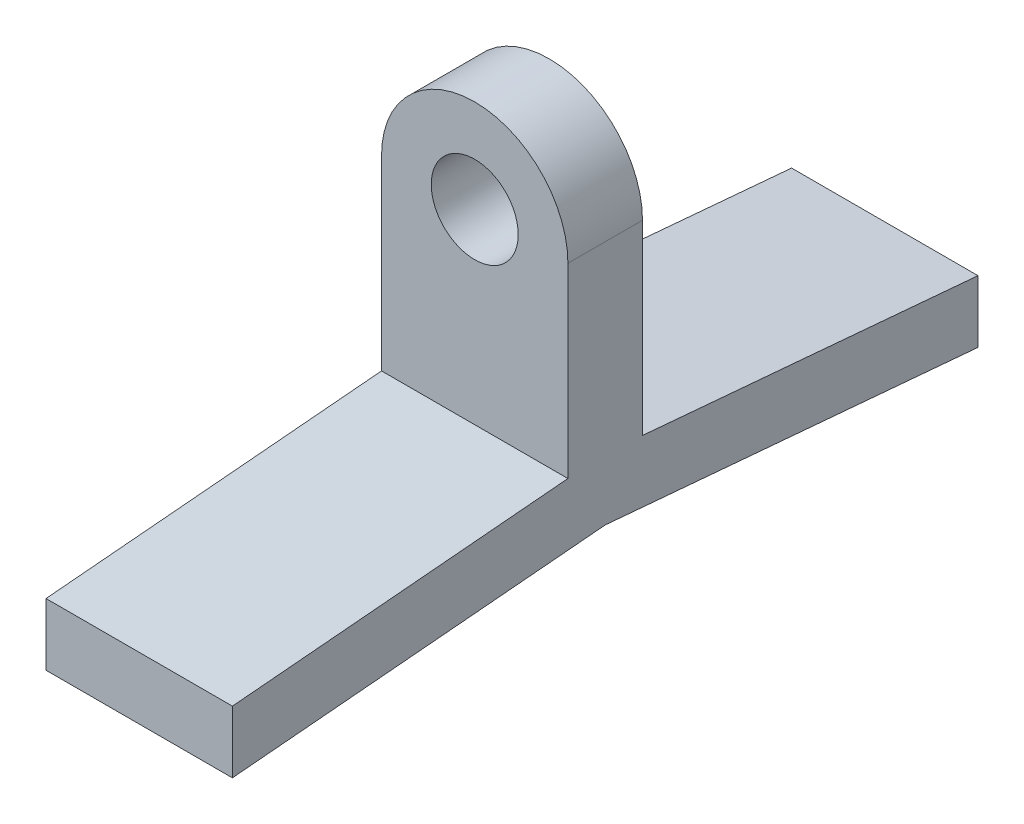
ISO-10303-21;
HEADER;
FILE_DESCRIPTION(('STEP AP214'),'2;1');
FILE_NAME('part.step','',(''),(''),'','','');
FILE_SCHEMA(('AUTOMOTIVE_DESIGN { 1 0 10303 214 1 1 1 1 }'));
ENDSEC;
DATA;
#1=APPLICATION_CONTEXT('core data for automotive mechanical design processes');
#2=APPLICATION_PROTOCOL_DEFINITION('international standard','automotive_design',2000,#1);
#3=PRODUCT_CONTEXT('',#1,'mechanical');
#4=PRODUCT('Part','Part','',(#3));
#5=PRODUCT_RELATED_PRODUCT_CATEGORY('part','',(#4));
#6=PRODUCT_DEFINITION_FORMATION('','',#4);
#7=PRODUCT_DEFINITION_CONTEXT('part definition',#1,'design');
#8=PRODUCT_DEFINITION('design','',#6,#7);
#9=PRODUCT_DEFINITION_SHAPE('','',#8);
#10=(LENGTH_UNIT() NAMED_UNIT(*) SI_UNIT(.MILLI.,.METRE.));
#11=(NAMED_UNIT(*) PLANE_ANGLE_UNIT() SI_UNIT($,.RADIAN.));
#12=(NAMED_UNIT(*) SI_UNIT($,.STERADIAN.) SOLID_ANGLE_UNIT());
#13=UNCERTAINTY_MEASURE_WITH_UNIT(LENGTH_MEASURE(1.E-05),#10,'distance_accuracy_value','');
#14=(GEOMETRIC_REPRESENTATION_CONTEXT(3) GLOBAL_UNCERTAINTY_ASSIGNED_CONTEXT((#13)) GLOBAL_UNIT_ASSIGNED_CONTEXT((#10,
#11,#12)) REPRESENTATION_CONTEXT('',''));
#15=CARTESIAN_POINT('',(0.,0.,0.));
#16=DIRECTION('',(0.,0.,1.));
#17=DIRECTION('',(1.,0.,0.));
#18=AXIS2_PLACEMENT_3D('',#15,#16,#17);
#19=CARTESIAN_POINT('',(0.,0.,6.));
#20=DIRECTION('',(0.,0.,-1.));
#21=DIRECTION('',(-1.,0.,0.));
#22=AXIS2_PLACEMENT_3D('',#19,#20,#21);
#23=PLANE('',#22);
#24=CARTESIAN_POINT('',(0.,0.,6.));
#25=DIRECTION('',(0.,0.,1.));
#26=DIRECTION('',(-1.,0.,0.));
#27=AXIS2_PLACEMENT_3D('',#24,#25,#26);
#28=CIRCLE('',#27,7.5);
#29=CARTESIAN_POINT('',(7.5,0.,6.));
#30=VERTEX_POINT('',#29);
#31=CARTESIAN_POINT('',(-7.5,0.,6.));
#32=VERTEX_POINT('',#31);
#33=EDGE_CURVE('E184',#30,#32,#28,.T.);
#34=ORIENTED_EDGE('',*,*,#33,.T.);
#35=DIRECTION('',(0.,-1.,0.));
#36=VECTOR('',#35,1.);
#37=CARTESIAN_POINT('',(-7.5,0.,6.));
#38=LINE('',#37,#36);
#39=CARTESIAN_POINT('',(-7.5,-15.,6.));
#40=VERTEX_POINT('',#39);
#41=EDGE_CURVE('E83',#32,#40,#38,.T.);
#42=ORIENTED_EDGE('',*,*,#41,.T.);
#43=DIRECTION('',(1.,0.,0.));
#44=VECTOR('',#43,1.);
#45=CARTESIAN_POINT('',(-7.5,-15.,6.));
#46=LINE('',#45,#44);
#47=CARTESIAN_POINT('',(7.5,-15.,6.));
#48=VERTEX_POINT('',#47);
#49=EDGE_CURVE('E189',#40,#48,#46,.T.);
#50=ORIENTED_EDGE('',*,*,#49,.T.);
#51=DIRECTION('',(0.,1.,0.));
#52=VECTOR('',#51,1.);
#53=CARTESIAN_POINT('',(7.5,-15.,6.));
#54=LINE('',#53,#52);
#55=EDGE_CURVE('E57',#48,#30,#54,.T.);
#56=ORIENTED_EDGE('',*,*,#55,.T.);
#57=EDGE_LOOP('',(#34,#42,#50,#56));
#58=FACE_BOUND('',#57,.T.);
#59=CARTESIAN_POINT('',(0.,0.,6.));
#60=DIRECTION('',(0.,0.,1.));
#61=DIRECTION('',(1.,0.,0.));
#62=AXIS2_PLACEMENT_3D('',#59,#60,#61);
#63=CIRCLE('',#62,3.5);
#64=CARTESIAN_POINT('',(3.5,0.,6.));
#65=VERTEX_POINT('',#64);
#66=EDGE_CURVE('E176',#65,#65,#63,.T.);
#67=ORIENTED_EDGE('',*,*,#66,.F.);
#68=EDGE_LOOP('',(#67));
#69=FACE_BOUND('',#68,.T.);
#70=ADVANCED_FACE('F39',(#58,#69),#23,.F.);
#71=CARTESIAN_POINT('',(0.,0.,0.));
#72=DIRECTION('',(0.,0.,-1.));
#73=DIRECTION('',(-1.,0.,0.));
#74=AXIS2_PLACEMENT_3D('',#71,#72,#73);
#75=PLANE('',#74);
#76=CARTESIAN_POINT('',(0.,0.,0.));
#77=DIRECTION('',(0.,0.,1.));
#78=DIRECTION('',(-1.,0.,0.));
#79=AXIS2_PLACEMENT_3D('',#76,#77,#78);
#80=CIRCLE('',#79,7.5);
#81=CARTESIAN_POINT('',(7.5,0.,0.));
#82=VERTEX_POINT('',#81);
#83=CARTESIAN_POINT('',(-7.5,0.,0.));
#84=VERTEX_POINT('',#83);
#85=EDGE_CURVE('E180',#82,#84,#80,.T.);
#86=ORIENTED_EDGE('',*,*,#85,.F.);
#87=DIRECTION('',(0.,1.,0.));
#88=VECTOR('',#87,1.);
#89=CARTESIAN_POINT('',(7.5,-15.,0.));
#90=LINE('',#89,#88);
#91=CARTESIAN_POINT('',(7.5,-15.,0.));
#92=VERTEX_POINT('',#91);
#93=EDGE_CURVE('E72',#92,#82,#90,.T.);
#94=ORIENTED_EDGE('',*,*,#93,.F.);
#95=DIRECTION('',(1.,0.,0.));
#96=VECTOR('',#95,1.);
#97=CARTESIAN_POINT('',(-7.5,-15.,0.));
#98=LINE('',#97,#96);
#99=CARTESIAN_POINT('',(-7.5,-15.,0.));
#100=VERTEX_POINT('',#99);
#101=EDGE_CURVE('E201',#100,#92,#98,.T.);
#102=ORIENTED_EDGE('',*,*,#101,.F.);
#103=DIRECTION('',(0.,-1.,0.));
#104=VECTOR('',#103,1.);
#105=CARTESIAN_POINT('',(-7.5,0.,0.));
#106=LINE('',#105,#104);
#107=EDGE_CURVE('E197',#84,#100,#106,.T.);
#108=ORIENTED_EDGE('',*,*,#107,.F.);
#109=EDGE_LOOP('',(#86,#94,#102,#108));
#110=FACE_BOUND('',#109,.T.);
#111=CARTESIAN_POINT('',(0.,0.,0.));
#112=DIRECTION('',(0.,0.,1.));
#113=DIRECTION('',(1.,0.,0.));
#114=AXIS2_PLACEMENT_3D('',#111,#112,#113);
#115=CIRCLE('',#114,3.5);
#116=CARTESIAN_POINT('',(3.5,0.,0.));
#117=VERTEX_POINT('',#116);
#118=EDGE_CURVE('E175',#117,#117,#115,.T.);
#119=ORIENTED_EDGE('',*,*,#118,.T.);
#120=EDGE_LOOP('',(#119));
#121=FACE_BOUND('',#120,.T.);
#122=ADVANCED_FACE('F210',(#110,#121),#75,.T.);
#123=CARTESIAN_POINT('',(0.,0.,6.));
#124=DIRECTION('',(0.,0.,-1.));
#125=DIRECTION('',(-1.,0.,0.));
#126=AXIS2_PLACEMENT_3D('',#123,#124,#125);
#127=CYLINDRICAL_SURFACE('',#126,7.5);
#128=ORIENTED_EDGE('',*,*,#85,.T.);
#129=DIRECTION('',(0.,0.,-1.));
#130=VECTOR('',#129,1.);
#131=CARTESIAN_POINT('',(-7.5,0.,6.));
#132=LINE('',#131,#130);
#133=EDGE_CURVE('E11',#32,#84,#132,.T.);
#134=ORIENTED_EDGE('',*,*,#133,.F.);
#135=ORIENTED_EDGE('',*,*,#33,.F.);
#136=DIRECTION('',(0.,0.,-1.));
#137=VECTOR('',#136,1.);
#138=CARTESIAN_POINT('',(7.5,0.,6.));
#139=LINE('',#138,#137);
#140=EDGE_CURVE('E49',#30,#82,#139,.T.);
#141=ORIENTED_EDGE('',*,*,#140,.T.);
#142=EDGE_LOOP('',(#128,#134,#135,#141));
#143=FACE_BOUND('',#142,.T.);
#144=ADVANCED_FACE('F41',(#143),#127,.T.);
#145=CARTESIAN_POINT('',(-7.5,0.,6.));
#146=DIRECTION('',(1.,0.,0.));
#147=DIRECTION('',(0.,1.,0.));
#148=AXIS2_PLACEMENT_3D('',#145,#146,#147);
#149=PLANE('',#148);
#150=ORIENTED_EDGE('',*,*,#107,.T.);
#151=DIRECTION('',(0.,-0.087155742747658,-0.996194698091746));
#152=VECTOR('',#151,1.);
#153=CARTESIAN_POINT('',(-7.5,-17.3621939152,-27.));
#154=LINE('',#153,#152);
#155=CARTESIAN_POINT('',(-7.5,-17.3621939151999,-27.));
#156=VERTEX_POINT('',#155);
#157=EDGE_CURVE('E146',#100,#156,#154,.T.);
#158=ORIENTED_EDGE('',*,*,#157,.T.);
#159=DIRECTION('',(0.,-1.,0.));
#160=VECTOR('',#159,1.);
#161=CARTESIAN_POINT('',(-7.5,-22.3621939152,-27.));
#162=LINE('',#161,#160);
#163=CARTESIAN_POINT('',(-7.5,-22.3621939152,-27.));
#164=VERTEX_POINT('',#163);
#165=EDGE_CURVE('E257',#156,#164,#162,.T.);
#166=ORIENTED_EDGE('',*,*,#165,.T.);
#167=DIRECTION('',(0.,0.0871557427476586,0.996194698091746));
#168=VECTOR('',#167,1.);
#169=CARTESIAN_POINT('',(-7.5,-19.7375340094222,2.99999999999996));
#170=LINE('',#169,#168);
#171=CARTESIAN_POINT('',(-7.5,-19.7375340094222,2.99999999999996));
#172=VERTEX_POINT('',#171);
#173=EDGE_CURVE('E260',#164,#172,#170,.T.);
#174=ORIENTED_EDGE('',*,*,#173,.T.);
#175=DIRECTION('',(0.,-0.0871557427476586,0.996194698091746));
#176=VECTOR('',#175,1.);
#177=CARTESIAN_POINT('',(-7.5,-22.3621939152,33.));
#178=LINE('',#177,#176);
#179=CARTESIAN_POINT('',(-7.5,-22.3621939152,33.));
#180=VERTEX_POINT('',#179);
#181=EDGE_CURVE('E264',#172,#180,#178,.T.);
#182=ORIENTED_EDGE('',*,*,#181,.T.);
#183=DIRECTION('',(0.,1.,0.));
#184=VECTOR('',#183,1.);
#185=CARTESIAN_POINT('',(-7.5,-17.3621939151999,33.));
#186=LINE('',#185,#184);
#187=CARTESIAN_POINT('',(-7.50000000000001,-17.3621939151999,33.));
#188=VERTEX_POINT('',#187);
#189=EDGE_CURVE('E164',#180,#188,#186,.T.);
#190=ORIENTED_EDGE('',*,*,#189,.T.);
#191=DIRECTION('',(0.,0.0871557427476582,-0.996194698091746));
#192=VECTOR('',#191,1.);
#193=CARTESIAN_POINT('',(-7.5,-15.,6.));
#194=LINE('',#193,#192);
#195=EDGE_CURVE('E125',#188,#40,#194,.T.);
#196=ORIENTED_EDGE('',*,*,#195,.T.);
#197=ORIENTED_EDGE('',*,*,#41,.F.);
#198=ORIENTED_EDGE('',*,*,#133,.T.);
#199=EDGE_LOOP('',(#150,#158,#166,#174,#182,#190,#196,#197,#198));
#200=FACE_BOUND('',#199,.T.);
#201=ADVANCED_FACE('F213',(#200),#149,.F.);
#202=CARTESIAN_POINT('',(7.5,-15.,6.));
#203=DIRECTION('',(-1.,0.,0.));
#204=DIRECTION('',(0.,-1.,0.));
#205=AXIS2_PLACEMENT_3D('',#202,#203,#204);
#206=PLANE('',#205);
#207=ORIENTED_EDGE('',*,*,#93,.T.);
#208=ORIENTED_EDGE('',*,*,#140,.F.);
#209=ORIENTED_EDGE('',*,*,#55,.F.);
#210=DIRECTION('',(0.,-0.0871557427476581,0.996194698091745));
#211=VECTOR('',#210,1.);
#212=CARTESIAN_POINT('',(7.5,-15.,6.));
#213=LINE('',#212,#211);
#214=CARTESIAN_POINT('',(7.5,-17.3621939151999,33.));
#215=VERTEX_POINT('',#214);
#216=EDGE_CURVE('E124',#48,#215,#213,.T.);
#217=ORIENTED_EDGE('',*,*,#216,.T.);
#218=DIRECTION('',(0.,-1.,0.));
#219=VECTOR('',#218,1.);
#220=CARTESIAN_POINT('',(7.5,-17.3621939151999,33.));
#221=LINE('',#220,#219);
#222=CARTESIAN_POINT('',(7.5,-22.3621939151999,33.));
#223=VERTEX_POINT('',#222);
#224=EDGE_CURVE('E133',#215,#223,#221,.T.);
#225=ORIENTED_EDGE('',*,*,#224,.T.);
#226=DIRECTION('',(0.,0.0871557427476586,-0.996194698091746));
#227=VECTOR('',#226,1.);
#228=CARTESIAN_POINT('',(7.5,-22.3621939151999,33.));
#229=LINE('',#228,#227);
#230=CARTESIAN_POINT('',(7.5,-19.7375340094222,2.99999999999996));
#231=VERTEX_POINT('',#230);
#232=EDGE_CURVE('E139',#223,#231,#229,.T.);
#233=ORIENTED_EDGE('',*,*,#232,.T.);
#234=DIRECTION('',(0.,-0.0871557427476586,-0.996194698091746));
#235=VECTOR('',#234,1.);
#236=CARTESIAN_POINT('',(7.5,-19.7375340094222,2.99999999999996));
#237=LINE('',#236,#235);
#238=CARTESIAN_POINT('',(7.5,-22.3621939151999,-27.));
#239=VERTEX_POINT('',#238);
#240=EDGE_CURVE('E151',#231,#239,#237,.T.);
#241=ORIENTED_EDGE('',*,*,#240,.T.);
#242=DIRECTION('',(0.,1.,0.));
#243=VECTOR('',#242,1.);
#244=CARTESIAN_POINT('',(7.5,-22.3621939151999,-27.));
#245=LINE('',#244,#243);
#246=CARTESIAN_POINT('',(7.5,-17.3621939151999,-27.));
#247=VERTEX_POINT('',#246);
#248=EDGE_CURVE('E155',#239,#247,#245,.T.);
#249=ORIENTED_EDGE('',*,*,#248,.T.);
#250=DIRECTION('',(0.,0.087155742747658,0.996194698091746));
#251=VECTOR('',#250,1.);
#252=CARTESIAN_POINT('',(7.5,-17.3621939151999,-27.));
#253=LINE('',#252,#251);
#254=EDGE_CURVE('E130',#247,#92,#253,.T.);
#255=ORIENTED_EDGE('',*,*,#254,.T.);
#256=EDGE_LOOP('',(#207,#208,#209,#217,#225,#233,#241,#249,#255));
#257=FACE_BOUND('',#256,.T.);
#258=ADVANCED_FACE('F141',(#257),#206,.F.);
#259=CARTESIAN_POINT('',(0.,0.,6.));
#260=DIRECTION('',(0.,0.,-1.));
#261=DIRECTION('',(-1.,0.,0.));
#262=AXIS2_PLACEMENT_3D('',#259,#260,#261);
#263=CYLINDRICAL_SURFACE('',#262,3.5);
#264=ORIENTED_EDGE('',*,*,#66,.T.);
#265=EDGE_LOOP('',(#264));
#266=FACE_BOUND('',#265,.T.);
#267=ORIENTED_EDGE('',*,*,#118,.F.);
#268=EDGE_LOOP('',(#267));
#269=FACE_BOUND('',#268,.T.);
#270=ADVANCED_FACE('F219',(#266,#269),#263,.F.);
#271=CARTESIAN_POINT('',(-67.9499950309759,-17.3621939152,-27.));
#272=DIRECTION('',(0.,0.996194698091746,-0.087155742747658));
#273=DIRECTION('',(0.,0.087155742747658,0.996194698091746));
#274=AXIS2_PLACEMENT_3D('',#271,#272,#273);
#275=PLANE('',#274);
#276=ORIENTED_EDGE('',*,*,#157,.F.);
#277=ORIENTED_EDGE('',*,*,#101,.T.);
#278=ORIENTED_EDGE('',*,*,#254,.F.);
#279=DIRECTION('',(1.,0.,0.));
#280=VECTOR('',#279,1.);
#281=CARTESIAN_POINT('',(-67.9499950309759,-17.3621939152,-27.));
#282=LINE('',#281,#280);
#283=EDGE_CURVE('E161',#156,#247,#282,.T.);
#284=ORIENTED_EDGE('',*,*,#283,.F.);
#285=EDGE_LOOP('',(#276,#277,#278,#284));
#286=FACE_BOUND('',#285,.T.);
#287=ADVANCED_FACE('F231',(#286),#275,.T.);
#288=CARTESIAN_POINT('',(-67.9499950309759,-22.3621939152,-27.));
#289=DIRECTION('',(0.,0.,-1.));
#290=DIRECTION('',(0.,1.,0.));
#291=AXIS2_PLACEMENT_3D('',#288,#289,#290);
#292=PLANE('',#291);
#293=ORIENTED_EDGE('',*,*,#165,.F.);
#294=ORIENTED_EDGE('',*,*,#283,.T.);
#295=ORIENTED_EDGE('',*,*,#248,.F.);
#296=DIRECTION('',(1.,0.,0.));
#297=VECTOR('',#296,1.);
#298=CARTESIAN_POINT('',(-67.9499950309759,-22.3621939152,-27.));
#299=LINE('',#298,#297);
#300=EDGE_CURVE('E165',#164,#239,#299,.T.);
#301=ORIENTED_EDGE('',*,*,#300,.F.);
#302=EDGE_LOOP('',(#293,#294,#295,#301));
#303=FACE_BOUND('',#302,.T.);
#304=ADVANCED_FACE('F244',(#303),#292,.T.);
#305=CARTESIAN_POINT('',(-67.9499950309759,-19.7375340094222,2.99999999999996));
#306=DIRECTION('',(0.,-0.996194698091746,0.0871557427476586));
#307=DIRECTION('',(0.,-0.0871557427476586,-0.996194698091746));
#308=AXIS2_PLACEMENT_3D('',#305,#306,#307);
#309=PLANE('',#308);
#310=ORIENTED_EDGE('',*,*,#173,.F.);
#311=ORIENTED_EDGE('',*,*,#300,.T.);
#312=ORIENTED_EDGE('',*,*,#240,.F.);
#313=DIRECTION('',(1.,0.,0.));
#314=VECTOR('',#313,1.);
#315=CARTESIAN_POINT('',(-67.9499950309759,-19.7375340094222,2.99999999999996));
#316=LINE('',#315,#314);
#317=EDGE_CURVE('E168',#172,#231,#316,.T.);
#318=ORIENTED_EDGE('',*,*,#317,.F.);
#319=EDGE_LOOP('',(#310,#311,#312,#318));
#320=FACE_BOUND('',#319,.T.);
#321=ADVANCED_FACE('F240',(#320),#309,.T.);
#322=CARTESIAN_POINT('',(-67.9499950309759,-22.3621939152,33.));
#323=DIRECTION('',(0.,-0.996194698091746,-0.0871557427476586));
#324=DIRECTION('',(0.,0.0871557427476586,-0.996194698091746));
#325=AXIS2_PLACEMENT_3D('',#322,#323,#324);
#326=PLANE('',#325);
#327=ORIENTED_EDGE('',*,*,#181,.F.);
#328=ORIENTED_EDGE('',*,*,#317,.T.);
#329=ORIENTED_EDGE('',*,*,#232,.F.);
#330=DIRECTION('',(1.,0.,0.));
#331=VECTOR('',#330,1.);
#332=CARTESIAN_POINT('',(-67.9499950309759,-22.3621939152,33.));
#333=LINE('',#332,#331);
#334=EDGE_CURVE('E129',#180,#223,#333,.T.);
#335=ORIENTED_EDGE('',*,*,#334,.F.);
#336=EDGE_LOOP('',(#327,#328,#329,#335));
#337=FACE_BOUND('',#336,.T.);
#338=ADVANCED_FACE('F237',(#337),#326,.T.);
#339=CARTESIAN_POINT('',(-67.9499950309759,-17.3621939152,33.));
#340=DIRECTION('',(0.,0.,1.));
#341=DIRECTION('',(1.,0.,0.));
#342=AXIS2_PLACEMENT_3D('',#339,#340,#341);
#343=PLANE('',#342);
#344=ORIENTED_EDGE('',*,*,#189,.F.);
#345=ORIENTED_EDGE('',*,*,#334,.T.);
#346=ORIENTED_EDGE('',*,*,#224,.F.);
#347=DIRECTION('',(1.,0.,0.));
#348=VECTOR('',#347,1.);
#349=CARTESIAN_POINT('',(-67.9499950309759,-17.3621939152,33.));
#350=LINE('',#349,#348);
#351=EDGE_CURVE('E119',#188,#215,#350,.T.);
#352=ORIENTED_EDGE('',*,*,#351,.F.);
#353=EDGE_LOOP('',(#344,#345,#346,#352));
#354=FACE_BOUND('',#353,.T.);
#355=ADVANCED_FACE('F134',(#354),#343,.T.);
#356=CARTESIAN_POINT('',(-67.9499950309759,-15.,6.));
#357=DIRECTION('',(0.,0.996194698091746,0.0871557427476582));
#358=DIRECTION('',(0.,-0.0871557427476582,0.996194698091746));
#359=AXIS2_PLACEMENT_3D('',#356,#357,#358);
#360=PLANE('',#359);
#361=ORIENTED_EDGE('',*,*,#195,.F.);
#362=ORIENTED_EDGE('',*,*,#351,.T.);
#363=ORIENTED_EDGE('',*,*,#216,.F.);
#364=ORIENTED_EDGE('',*,*,#49,.F.);
#365=EDGE_LOOP('',(#361,#362,#363,#364));
#366=FACE_BOUND('',#365,.T.);
#367=ADVANCED_FACE('F121',(#366),#360,.T.);
#368=CLOSED_SHELL('',(#70,#122,#144,#201,#258,#270,#287,#304,#321,#338,#355,#367));
#369=MANIFOLD_SOLID_BREP('B2',#368);
#370=ADVANCED_BREP_SHAPE_REPRESENTATION('',(#18,#369),#14);
#371=SHAPE_DEFINITION_REPRESENTATION(#9,#370);
ENDSEC;
END-ISO-10303-21;
